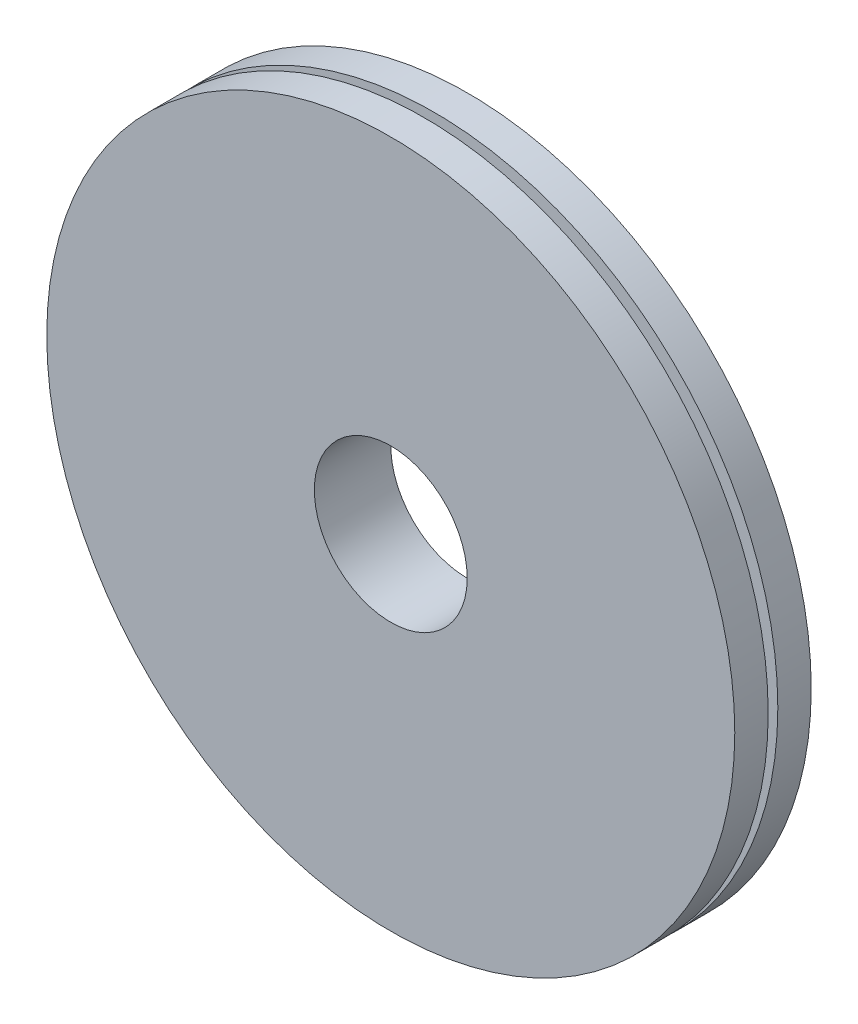
ISO-10303-21;
HEADER;
FILE_DESCRIPTION(('STEP AP214'),'2;1');
FILE_NAME('part.step','',(''),(''),'','','');
FILE_SCHEMA(('AUTOMOTIVE_DESIGN { 1 0 10303 214 1 1 1 1 }'));
ENDSEC;
DATA;
#1=APPLICATION_CONTEXT('core data for automotive mechanical design processes');
#2=APPLICATION_PROTOCOL_DEFINITION('international standard','automotive_design',2000,#1);
#3=PRODUCT_CONTEXT('',#1,'mechanical');
#4=PRODUCT('Part','Part','',(#3));
#5=PRODUCT_RELATED_PRODUCT_CATEGORY('part','',(#4));
#6=PRODUCT_DEFINITION_FORMATION('','',#4);
#7=PRODUCT_DEFINITION_CONTEXT('part definition',#1,'design');
#8=PRODUCT_DEFINITION('design','',#6,#7);
#9=PRODUCT_DEFINITION_SHAPE('','',#8);
#10=(LENGTH_UNIT() NAMED_UNIT(*) SI_UNIT(.MILLI.,.METRE.));
#11=(NAMED_UNIT(*) PLANE_ANGLE_UNIT() SI_UNIT($,.RADIAN.));
#12=(NAMED_UNIT(*) SI_UNIT($,.STERADIAN.) SOLID_ANGLE_UNIT());
#13=UNCERTAINTY_MEASURE_WITH_UNIT(LENGTH_MEASURE(1.E-05),#10,'distance_accuracy_value','');
#14=(GEOMETRIC_REPRESENTATION_CONTEXT(3) GLOBAL_UNCERTAINTY_ASSIGNED_CONTEXT((#13)) GLOBAL_UNIT_ASSIGNED_CONTEXT((#10,
#11,#12)) REPRESENTATION_CONTEXT('',''));
#15=CARTESIAN_POINT('',(0.,0.,0.));
#16=DIRECTION('',(0.,0.,1.));
#17=DIRECTION('',(1.,0.,0.));
#18=AXIS2_PLACEMENT_3D('',#15,#16,#17);
#19=CARTESIAN_POINT('',(0.,0.,12.7));
#20=DIRECTION('',(0.,0.,-1.));
#21=DIRECTION('',(-1.,0.,0.));
#22=AXIS2_PLACEMENT_3D('',#19,#20,#21);
#23=CYLINDRICAL_SURFACE('',#22,57.15);
#24=CARTESIAN_POINT('',(0.,0.,12.7));
#25=DIRECTION('',(0.,0.,1.));
#26=DIRECTION('',(1.,0.,0.));
#27=AXIS2_PLACEMENT_3D('',#24,#25,#26);
#28=CIRCLE('',#27,57.15);
#29=CARTESIAN_POINT('',(57.15,0.,12.7));
#30=VERTEX_POINT('',#29);
#31=EDGE_CURVE('E10',#30,#30,#28,.T.);
#32=ORIENTED_EDGE('',*,*,#31,.F.);
#33=EDGE_LOOP('',(#32));
#34=FACE_BOUND('',#33,.T.);
#35=CARTESIAN_POINT('',(0.,0.,7.1501));
#36=DIRECTION('',(0.,0.,-1.));
#37=DIRECTION('',(-1.,0.,0.));
#38=AXIS2_PLACEMENT_3D('',#35,#36,#37);
#39=CIRCLE('',#38,57.15);
#40=CARTESIAN_POINT('',(-57.15,0.,7.1501));
#41=VERTEX_POINT('',#40);
#42=EDGE_CURVE('E56',#41,#41,#39,.T.);
#43=ORIENTED_EDGE('',*,*,#42,.F.);
#44=EDGE_LOOP('',(#43));
#45=FACE_BOUND('',#44,.T.);
#46=ADVANCED_FACE('F37',(#34,#45),#23,.T.);
#47=CARTESIAN_POINT('',(0.,0.,12.7));
#48=DIRECTION('',(0.,0.,1.));
#49=DIRECTION('',(1.,0.,0.));
#50=AXIS2_PLACEMENT_3D('',#47,#48,#49);
#51=PLANE('',#50);
#52=ORIENTED_EDGE('',*,*,#31,.T.);
#53=EDGE_LOOP('',(#52));
#54=FACE_BOUND('',#53,.T.);
#55=CARTESIAN_POINT('',(0.,0.,12.7));
#56=DIRECTION('',(0.,0.,1.));
#57=DIRECTION('',(1.,0.,0.));
#58=AXIS2_PLACEMENT_3D('',#55,#56,#57);
#59=CIRCLE('',#58,12.7);
#60=CARTESIAN_POINT('',(12.7,0.,12.7));
#61=VERTEX_POINT('',#60);
#62=EDGE_CURVE('E50',#61,#61,#59,.T.);
#63=ORIENTED_EDGE('',*,*,#62,.F.);
#64=EDGE_LOOP('',(#63));
#65=FACE_BOUND('',#64,.T.);
#66=ADVANCED_FACE('F88',(#54,#65),#51,.T.);
#67=CARTESIAN_POINT('',(0.,0.,0.));
#68=DIRECTION('',(0.,0.,1.));
#69=DIRECTION('',(1.,0.,0.));
#70=AXIS2_PLACEMENT_3D('',#67,#68,#69);
#71=PLANE('',#70);
#72=CARTESIAN_POINT('',(0.,0.,0.));
#73=DIRECTION('',(0.,0.,1.));
#74=DIRECTION('',(1.,0.,0.));
#75=AXIS2_PLACEMENT_3D('',#72,#73,#74);
#76=CIRCLE('',#75,57.15);
#77=CARTESIAN_POINT('',(57.15,0.,0.));
#78=VERTEX_POINT('',#77);
#79=EDGE_CURVE('E41',#78,#78,#76,.T.);
#80=ORIENTED_EDGE('',*,*,#79,.F.);
#81=EDGE_LOOP('',(#80));
#82=FACE_BOUND('',#81,.T.);
#83=CARTESIAN_POINT('',(0.,0.,0.));
#84=DIRECTION('',(0.,0.,1.));
#85=DIRECTION('',(1.,0.,0.));
#86=AXIS2_PLACEMENT_3D('',#83,#84,#85);
#87=CIRCLE('',#86,12.7);
#88=CARTESIAN_POINT('',(12.7,0.,0.));
#89=VERTEX_POINT('',#88);
#90=EDGE_CURVE('E52',#89,#89,#87,.T.);
#91=ORIENTED_EDGE('',*,*,#90,.T.);
#92=EDGE_LOOP('',(#91));
#93=FACE_BOUND('',#92,.T.);
#94=ADVANCED_FACE('F93',(#82,#93),#71,.F.);
#95=CARTESIAN_POINT('',(0.,0.,5.5499));
#96=DIRECTION('',(0.,0.,-1.));
#97=DIRECTION('',(-1.,0.,0.));
#98=AXIS2_PLACEMENT_3D('',#95,#96,#97);
#99=CIRCLE('',#98,57.15);
#100=CARTESIAN_POINT('',(-57.15,0.,5.5499));
#101=VERTEX_POINT('',#100);
#102=EDGE_CURVE('E60',#101,#101,#99,.T.);
#103=ORIENTED_EDGE('',*,*,#102,.T.);
#104=EDGE_LOOP('',(#103));
#105=FACE_BOUND('',#104,.T.);
#106=ORIENTED_EDGE('',*,*,#79,.T.);
#107=EDGE_LOOP('',(#106));
#108=FACE_BOUND('',#107,.T.);
#109=ADVANCED_FACE('F39',(#105,#108),#23,.T.);
#110=CARTESIAN_POINT('',(0.,0.,12.7));
#111=DIRECTION('',(0.,0.,-1.));
#112=DIRECTION('',(-1.,0.,0.));
#113=AXIS2_PLACEMENT_3D('',#110,#111,#112);
#114=CYLINDRICAL_SURFACE('',#113,12.7);
#115=ORIENTED_EDGE('',*,*,#62,.T.);
#116=EDGE_LOOP('',(#115));
#117=FACE_BOUND('',#116,.T.);
#118=ORIENTED_EDGE('',*,*,#90,.F.);
#119=EDGE_LOOP('',(#118));
#120=FACE_BOUND('',#119,.T.);
#121=ADVANCED_FACE('F83',(#117,#120),#114,.F.);
#122=CARTESIAN_POINT('',(0.,0.,7.1501));
#123=DIRECTION('',(0.,0.,-1.));
#124=DIRECTION('',(-1.,0.,0.));
#125=AXIS2_PLACEMENT_3D('',#122,#123,#124);
#126=PLANE('',#125);
#127=CARTESIAN_POINT('',(0.,0.,7.1501));
#128=DIRECTION('',(0.,0.,-1.));
#129=DIRECTION('',(-1.,0.,0.));
#130=AXIS2_PLACEMENT_3D('',#127,#128,#129);
#131=CIRCLE('',#130,53.975);
#132=CARTESIAN_POINT('',(-53.975,0.,7.1501));
#133=VERTEX_POINT('',#132);
#134=EDGE_CURVE('E64',#133,#133,#131,.T.);
#135=ORIENTED_EDGE('',*,*,#134,.F.);
#136=EDGE_LOOP('',(#135));
#137=FACE_BOUND('',#136,.T.);
#138=ORIENTED_EDGE('',*,*,#42,.T.);
#139=EDGE_LOOP('',(#138));
#140=FACE_BOUND('',#139,.T.);
#141=ADVANCED_FACE('F79',(#137,#140),#126,.T.);
#142=CARTESIAN_POINT('',(0.,0.,5.5499));
#143=DIRECTION('',(0.,0.,-1.));
#144=DIRECTION('',(-1.,0.,0.));
#145=AXIS2_PLACEMENT_3D('',#142,#143,#144);
#146=PLANE('',#145);
#147=CARTESIAN_POINT('',(0.,0.,5.5499));
#148=DIRECTION('',(0.,0.,-1.));
#149=DIRECTION('',(-1.,0.,0.));
#150=AXIS2_PLACEMENT_3D('',#147,#148,#149);
#151=CIRCLE('',#150,53.975);
#152=CARTESIAN_POINT('',(-53.975,0.,5.5499));
#153=VERTEX_POINT('',#152);
#154=EDGE_CURVE('E68',#153,#153,#151,.T.);
#155=ORIENTED_EDGE('',*,*,#154,.T.);
#156=EDGE_LOOP('',(#155));
#157=FACE_BOUND('',#156,.T.);
#158=ORIENTED_EDGE('',*,*,#102,.F.);
#159=EDGE_LOOP('',(#158));
#160=FACE_BOUND('',#159,.T.);
#161=ADVANCED_FACE('F82',(#157,#160),#146,.F.);
#162=CARTESIAN_POINT('',(0.,0.,7.1501));
#163=DIRECTION('',(0.,0.,-1.));
#164=DIRECTION('',(-1.,0.,0.));
#165=AXIS2_PLACEMENT_3D('',#162,#163,#164);
#166=CYLINDRICAL_SURFACE('',#165,53.975);
#167=ORIENTED_EDGE('',*,*,#134,.T.);
#168=EDGE_LOOP('',(#167));
#169=FACE_BOUND('',#168,.T.);
#170=ORIENTED_EDGE('',*,*,#154,.F.);
#171=EDGE_LOOP('',(#170));
#172=FACE_BOUND('',#171,.T.);
#173=ADVANCED_FACE('F76',(#169,#172),#166,.T.);
#174=CLOSED_SHELL('',(#46,#66,#94,#109,#121,#141,#161,#173));
#175=MANIFOLD_SOLID_BREP('B2',#174);
#176=ADVANCED_BREP_SHAPE_REPRESENTATION('',(#18,#175),#14);
#177=SHAPE_DEFINITION_REPRESENTATION(#9,#176);
ENDSEC;
END-ISO-10303-21;
